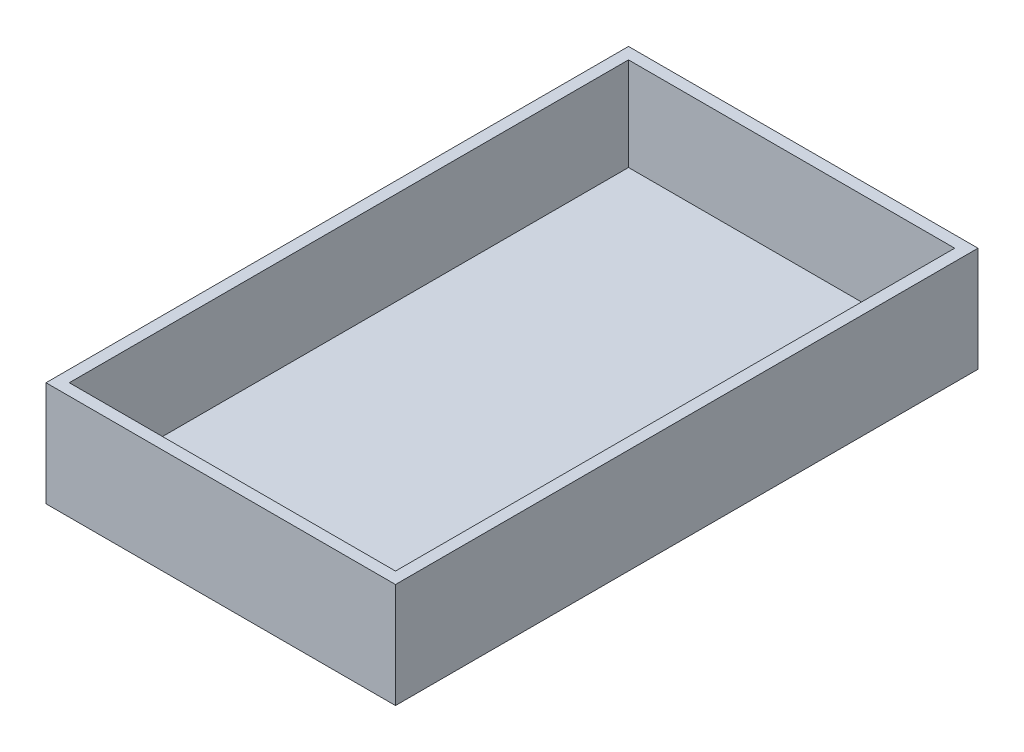
ISO-10303-21;
HEADER;
FILE_DESCRIPTION(('STEP AP214'),'2;1');
FILE_NAME('part.step','',(''),(''),'','','');
FILE_SCHEMA(('AUTOMOTIVE_DESIGN { 1 0 10303 214 1 1 1 1 }'));
ENDSEC;
DATA;
#1=APPLICATION_CONTEXT('core data for automotive mechanical design processes');
#2=APPLICATION_PROTOCOL_DEFINITION('international standard','automotive_design',2000,#1);
#3=PRODUCT_CONTEXT('',#1,'mechanical');
#4=PRODUCT('Part','Part','',(#3));
#5=PRODUCT_RELATED_PRODUCT_CATEGORY('part','',(#4));
#6=PRODUCT_DEFINITION_FORMATION('','',#4);
#7=PRODUCT_DEFINITION_CONTEXT('part definition',#1,'design');
#8=PRODUCT_DEFINITION('design','',#6,#7);
#9=PRODUCT_DEFINITION_SHAPE('','',#8);
#10=(LENGTH_UNIT() NAMED_UNIT(*) SI_UNIT(.MILLI.,.METRE.));
#11=(NAMED_UNIT(*) PLANE_ANGLE_UNIT() SI_UNIT($,.RADIAN.));
#12=(NAMED_UNIT(*) SI_UNIT($,.STERADIAN.) SOLID_ANGLE_UNIT());
#13=UNCERTAINTY_MEASURE_WITH_UNIT(LENGTH_MEASURE(1.E-05),#10,'distance_accuracy_value','');
#14=(GEOMETRIC_REPRESENTATION_CONTEXT(3) GLOBAL_UNCERTAINTY_ASSIGNED_CONTEXT((#13)) GLOBAL_UNIT_ASSIGNED_CONTEXT((#10,
#11,#12)) REPRESENTATION_CONTEXT('',''));
#15=CARTESIAN_POINT('',(0.,0.,0.));
#16=DIRECTION('',(0.,0.,1.));
#17=DIRECTION('',(1.,0.,0.));
#18=AXIS2_PLACEMENT_3D('',#15,#16,#17);
#19=CARTESIAN_POINT('',(-150.,-50.,500.));
#20=DIRECTION('',(1.,0.,0.));
#21=DIRECTION('',(0.,0.,-1.));
#22=AXIS2_PLACEMENT_3D('',#19,#20,#21);
#23=PLANE('',#22);
#24=DIRECTION('',(0.,0.,1.));
#25=VECTOR('',#24,1.);
#26=CARTESIAN_POINT('',(-150.,40.,500.));
#27=LINE('',#26,#25);
#28=CARTESIAN_POINT('',(-150.,40.,0.));
#29=VERTEX_POINT('',#28);
#30=CARTESIAN_POINT('',(-150.,40.,500.));
#31=VERTEX_POINT('',#30);
#32=EDGE_CURVE('E127',#29,#31,#27,.T.);
#33=ORIENTED_EDGE('',*,*,#32,.F.);
#34=DIRECTION('',(0.,-1.,0.));
#35=VECTOR('',#34,1.);
#36=CARTESIAN_POINT('',(-150.,-50.,0.));
#37=LINE('',#36,#35);
#38=CARTESIAN_POINT('',(-150.,-50.,0.));
#39=VERTEX_POINT('',#38);
#40=EDGE_CURVE('E107',#29,#39,#37,.T.);
#41=ORIENTED_EDGE('',*,*,#40,.T.);
#42=DIRECTION('',(0.,0.,-1.));
#43=VECTOR('',#42,1.);
#44=CARTESIAN_POINT('',(-150.,-50.,500.));
#45=LINE('',#44,#43);
#46=CARTESIAN_POINT('',(-150.,-50.,500.));
#47=VERTEX_POINT('',#46);
#48=EDGE_CURVE('E142',#47,#39,#45,.T.);
#49=ORIENTED_EDGE('',*,*,#48,.F.);
#50=DIRECTION('',(0.,-1.,0.));
#51=VECTOR('',#50,1.);
#52=CARTESIAN_POINT('',(-150.,-50.,500.));
#53=LINE('',#52,#51);
#54=EDGE_CURVE('E136',#31,#47,#53,.T.);
#55=ORIENTED_EDGE('',*,*,#54,.F.);
#56=EDGE_LOOP('',(#33,#41,#49,#55));
#57=FACE_BOUND('',#56,.T.);
#58=ADVANCED_FACE('F45',(#57),#23,.F.);
#59=CARTESIAN_POINT('',(150.,-50.,500.));
#60=DIRECTION('',(-1.,0.,0.));
#61=DIRECTION('',(0.,0.,1.));
#62=AXIS2_PLACEMENT_3D('',#59,#60,#61);
#63=PLANE('',#62);
#64=DIRECTION('',(0.,0.,-1.));
#65=VECTOR('',#64,1.);
#66=CARTESIAN_POINT('',(150.,40.,500.));
#67=LINE('',#66,#65);
#68=CARTESIAN_POINT('',(150.,40.,500.));
#69=VERTEX_POINT('',#68);
#70=CARTESIAN_POINT('',(150.,40.,0.));
#71=VERTEX_POINT('',#70);
#72=EDGE_CURVE('E63',#69,#71,#67,.T.);
#73=ORIENTED_EDGE('',*,*,#72,.F.);
#74=DIRECTION('',(0.,1.,0.));
#75=VECTOR('',#74,1.);
#76=CARTESIAN_POINT('',(150.,-50.,500.));
#77=LINE('',#76,#75);
#78=CARTESIAN_POINT('',(150.,-50.,500.));
#79=VERTEX_POINT('',#78);
#80=EDGE_CURVE('E138',#79,#69,#77,.T.);
#81=ORIENTED_EDGE('',*,*,#80,.F.);
#82=DIRECTION('',(0.,0.,-1.));
#83=VECTOR('',#82,1.);
#84=CARTESIAN_POINT('',(150.,-50.,500.));
#85=LINE('',#84,#83);
#86=CARTESIAN_POINT('',(150.,-50.,0.));
#87=VERTEX_POINT('',#86);
#88=EDGE_CURVE('E157',#79,#87,#85,.T.);
#89=ORIENTED_EDGE('',*,*,#88,.T.);
#90=DIRECTION('',(0.,1.,0.));
#91=VECTOR('',#90,1.);
#92=CARTESIAN_POINT('',(150.,-50.,0.));
#93=LINE('',#92,#91);
#94=EDGE_CURVE('E144',#87,#71,#93,.T.);
#95=ORIENTED_EDGE('',*,*,#94,.T.);
#96=EDGE_LOOP('',(#73,#81,#89,#95));
#97=FACE_BOUND('',#96,.T.);
#98=ADVANCED_FACE('F223',(#97),#63,.F.);
#99=CARTESIAN_POINT('',(0.,0.,500.));
#100=DIRECTION('',(0.,0.,1.));
#101=DIRECTION('',(1.,0.,0.));
#102=AXIS2_PLACEMENT_3D('',#99,#100,#101);
#103=PLANE('',#102);
#104=ORIENTED_EDGE('',*,*,#80,.T.);
#105=DIRECTION('',(1.,0.,0.));
#106=VECTOR('',#105,1.);
#107=CARTESIAN_POINT('',(150.,40.,500.));
#108=LINE('',#107,#106);
#109=EDGE_CURVE('E130',#31,#69,#108,.T.);
#110=ORIENTED_EDGE('',*,*,#109,.F.);
#111=ORIENTED_EDGE('',*,*,#54,.T.);
#112=DIRECTION('',(1.,0.,0.));
#113=VECTOR('',#112,1.);
#114=CARTESIAN_POINT('',(150.,-50.,500.));
#115=LINE('',#114,#113);
#116=EDGE_CURVE('E96',#47,#79,#115,.T.);
#117=ORIENTED_EDGE('',*,*,#116,.T.);
#118=EDGE_LOOP('',(#104,#110,#111,#117));
#119=FACE_BOUND('',#118,.T.);
#120=ADVANCED_FACE('F135',(#119),#103,.T.);
#121=CARTESIAN_POINT('',(0.,0.,0.));
#122=DIRECTION('',(0.,0.,1.));
#123=DIRECTION('',(1.,0.,0.));
#124=AXIS2_PLACEMENT_3D('',#121,#122,#123);
#125=PLANE('',#124);
#126=DIRECTION('',(-1.,0.,0.));
#127=VECTOR('',#126,1.);
#128=CARTESIAN_POINT('',(150.,40.,0.));
#129=LINE('',#128,#127);
#130=EDGE_CURVE('E131',#71,#29,#129,.T.);
#131=ORIENTED_EDGE('',*,*,#130,.F.);
#132=ORIENTED_EDGE('',*,*,#94,.F.);
#133=DIRECTION('',(1.,0.,0.));
#134=VECTOR('',#133,1.);
#135=CARTESIAN_POINT('',(150.,-50.,0.));
#136=LINE('',#135,#134);
#137=EDGE_CURVE('E150',#39,#87,#136,.T.);
#138=ORIENTED_EDGE('',*,*,#137,.F.);
#139=ORIENTED_EDGE('',*,*,#40,.F.);
#140=EDGE_LOOP('',(#131,#132,#138,#139));
#141=FACE_BOUND('',#140,.T.);
#142=ADVANCED_FACE('F218',(#141),#125,.F.);
#143=CARTESIAN_POINT('',(150.,-50.,500.));
#144=DIRECTION('',(0.,1.,0.));
#145=DIRECTION('',(-1.,0.,0.));
#146=AXIS2_PLACEMENT_3D('',#143,#144,#145);
#147=PLANE('',#146);
#148=ORIENTED_EDGE('',*,*,#137,.T.);
#149=ORIENTED_EDGE('',*,*,#88,.F.);
#150=ORIENTED_EDGE('',*,*,#116,.F.);
#151=ORIENTED_EDGE('',*,*,#48,.T.);
#152=EDGE_LOOP('',(#148,#149,#150,#151));
#153=FACE_BOUND('',#152,.T.);
#154=ADVANCED_FACE('F211',(#153),#147,.F.);
#155=CARTESIAN_POINT('',(0.,40.,0.));
#156=DIRECTION('',(0.,1.,0.));
#157=DIRECTION('',(-1.,0.,0.));
#158=AXIS2_PLACEMENT_3D('',#155,#156,#157);
#159=PLANE('',#158);
#160=DIRECTION('',(0.,0.,-1.));
#161=VECTOR('',#160,1.);
#162=CARTESIAN_POINT('',(140.,40.,500.));
#163=LINE('',#162,#161);
#164=CARTESIAN_POINT('',(140.,40.,490.));
#165=VERTEX_POINT('',#164);
#166=CARTESIAN_POINT('',(140.,40.,10.));
#167=VERTEX_POINT('',#166);
#168=EDGE_CURVE('E177',#165,#167,#163,.T.);
#169=ORIENTED_EDGE('',*,*,#168,.F.);
#170=DIRECTION('',(-1.,0.,0.));
#171=VECTOR('',#170,1.);
#172=CARTESIAN_POINT('',(150.,40.,490.));
#173=LINE('',#172,#171);
#174=CARTESIAN_POINT('',(-140.,40.,490.));
#175=VERTEX_POINT('',#174);
#176=EDGE_CURVE('E11',#165,#175,#173,.T.);
#177=ORIENTED_EDGE('',*,*,#176,.T.);
#178=DIRECTION('',(0.,0.,-1.));
#179=VECTOR('',#178,1.);
#180=CARTESIAN_POINT('',(-140.,40.,500.));
#181=LINE('',#180,#179);
#182=CARTESIAN_POINT('',(-140.,40.,10.));
#183=VERTEX_POINT('',#182);
#184=EDGE_CURVE('E193',#175,#183,#181,.T.);
#185=ORIENTED_EDGE('',*,*,#184,.T.);
#186=DIRECTION('',(-1.,0.,0.));
#187=VECTOR('',#186,1.);
#188=CARTESIAN_POINT('',(150.,40.,10.));
#189=LINE('',#188,#187);
#190=EDGE_CURVE('E116',#167,#183,#189,.T.);
#191=ORIENTED_EDGE('',*,*,#190,.F.);
#192=EDGE_LOOP('',(#169,#177,#185,#191));
#193=FACE_BOUND('',#192,.T.);
#194=ORIENTED_EDGE('',*,*,#32,.T.);
#195=ORIENTED_EDGE('',*,*,#109,.T.);
#196=ORIENTED_EDGE('',*,*,#72,.T.);
#197=ORIENTED_EDGE('',*,*,#130,.T.);
#198=EDGE_LOOP('',(#194,#195,#196,#197));
#199=FACE_BOUND('',#198,.T.);
#200=ADVANCED_FACE('F129',(#193,#199),#159,.T.);
#201=CARTESIAN_POINT('',(-140.,-50.,500.));
#202=DIRECTION('',(1.,0.,0.));
#203=DIRECTION('',(0.,0.,-1.));
#204=AXIS2_PLACEMENT_3D('',#201,#202,#203);
#205=PLANE('',#204);
#206=DIRECTION('',(0.,-1.,0.));
#207=VECTOR('',#206,1.);
#208=CARTESIAN_POINT('',(-140.,-50.,10.));
#209=LINE('',#208,#207);
#210=CARTESIAN_POINT('',(-140.,-40.,10.));
#211=VERTEX_POINT('',#210);
#212=EDGE_CURVE('E49',#183,#211,#209,.T.);
#213=ORIENTED_EDGE('',*,*,#212,.F.);
#214=ORIENTED_EDGE('',*,*,#184,.F.);
#215=DIRECTION('',(0.,-1.,0.));
#216=VECTOR('',#215,1.);
#217=CARTESIAN_POINT('',(-140.,-50.,490.));
#218=LINE('',#217,#216);
#219=CARTESIAN_POINT('',(-140.,-40.,490.));
#220=VERTEX_POINT('',#219);
#221=EDGE_CURVE('E173',#175,#220,#218,.T.);
#222=ORIENTED_EDGE('',*,*,#221,.T.);
#223=DIRECTION('',(0.,0.,-1.));
#224=VECTOR('',#223,1.);
#225=CARTESIAN_POINT('',(-140.,-40.,500.));
#226=LINE('',#225,#224);
#227=EDGE_CURVE('E189',#220,#211,#226,.T.);
#228=ORIENTED_EDGE('',*,*,#227,.T.);
#229=EDGE_LOOP('',(#213,#214,#222,#228));
#230=FACE_BOUND('',#229,.T.);
#231=ADVANCED_FACE('F199',(#230),#205,.T.);
#232=CARTESIAN_POINT('',(150.,-39.9999999999999,500.));
#233=DIRECTION('',(0.,1.,0.));
#234=DIRECTION('',(-1.,0.,0.));
#235=AXIS2_PLACEMENT_3D('',#232,#233,#234);
#236=PLANE('',#235);
#237=DIRECTION('',(1.,0.,0.));
#238=VECTOR('',#237,1.);
#239=CARTESIAN_POINT('',(150.,-39.9999999999999,10.));
#240=LINE('',#239,#238);
#241=CARTESIAN_POINT('',(140.,-39.9999999999999,10.));
#242=VERTEX_POINT('',#241);
#243=EDGE_CURVE('E72',#211,#242,#240,.T.);
#244=ORIENTED_EDGE('',*,*,#243,.F.);
#245=ORIENTED_EDGE('',*,*,#227,.F.);
#246=DIRECTION('',(1.,0.,0.));
#247=VECTOR('',#246,1.);
#248=CARTESIAN_POINT('',(150.,-39.9999999999999,490.));
#249=LINE('',#248,#247);
#250=CARTESIAN_POINT('',(140.,-39.9999999999999,490.));
#251=VERTEX_POINT('',#250);
#252=EDGE_CURVE('E170',#220,#251,#249,.T.);
#253=ORIENTED_EDGE('',*,*,#252,.T.);
#254=DIRECTION('',(0.,0.,-1.));
#255=VECTOR('',#254,1.);
#256=CARTESIAN_POINT('',(140.,-39.9999999999999,500.));
#257=LINE('',#256,#255);
#258=EDGE_CURVE('E183',#251,#242,#257,.T.);
#259=ORIENTED_EDGE('',*,*,#258,.T.);
#260=EDGE_LOOP('',(#244,#245,#253,#259));
#261=FACE_BOUND('',#260,.T.);
#262=ADVANCED_FACE('F201',(#261),#236,.T.);
#263=CARTESIAN_POINT('',(140.,-50.,500.));
#264=DIRECTION('',(-1.,0.,0.));
#265=DIRECTION('',(0.,0.,1.));
#266=AXIS2_PLACEMENT_3D('',#263,#264,#265);
#267=PLANE('',#266);
#268=DIRECTION('',(0.,1.,0.));
#269=VECTOR('',#268,1.);
#270=CARTESIAN_POINT('',(140.,-50.,10.));
#271=LINE('',#270,#269);
#272=EDGE_CURVE('E186',#242,#167,#271,.T.);
#273=ORIENTED_EDGE('',*,*,#272,.F.);
#274=ORIENTED_EDGE('',*,*,#258,.F.);
#275=DIRECTION('',(0.,1.,0.));
#276=VECTOR('',#275,1.);
#277=CARTESIAN_POINT('',(140.,-50.,490.));
#278=LINE('',#277,#276);
#279=EDGE_CURVE('E55',#251,#165,#278,.T.);
#280=ORIENTED_EDGE('',*,*,#279,.T.);
#281=ORIENTED_EDGE('',*,*,#168,.T.);
#282=EDGE_LOOP('',(#273,#274,#280,#281));
#283=FACE_BOUND('',#282,.T.);
#284=ADVANCED_FACE('F207',(#283),#267,.T.);
#285=CARTESIAN_POINT('',(0.,0.,490.));
#286=DIRECTION('',(0.,0.,1.));
#287=DIRECTION('',(1.,0.,0.));
#288=AXIS2_PLACEMENT_3D('',#285,#286,#287);
#289=PLANE('',#288);
#290=ORIENTED_EDGE('',*,*,#221,.F.);
#291=ORIENTED_EDGE('',*,*,#176,.F.);
#292=ORIENTED_EDGE('',*,*,#279,.F.);
#293=ORIENTED_EDGE('',*,*,#252,.F.);
#294=EDGE_LOOP('',(#290,#291,#292,#293));
#295=FACE_BOUND('',#294,.T.);
#296=ADVANCED_FACE('F209',(#295),#289,.F.);
#297=CARTESIAN_POINT('',(0.,0.,10.));
#298=DIRECTION('',(0.,0.,1.));
#299=DIRECTION('',(1.,0.,0.));
#300=AXIS2_PLACEMENT_3D('',#297,#298,#299);
#301=PLANE('',#300);
#302=ORIENTED_EDGE('',*,*,#212,.T.);
#303=ORIENTED_EDGE('',*,*,#243,.T.);
#304=ORIENTED_EDGE('',*,*,#272,.T.);
#305=ORIENTED_EDGE('',*,*,#190,.T.);
#306=EDGE_LOOP('',(#302,#303,#304,#305));
#307=FACE_BOUND('',#306,.T.);
#308=ADVANCED_FACE('F47',(#307),#301,.T.);
#309=CLOSED_SHELL('',(#58,#98,#120,#142,#154,#200,#231,#262,#284,#296,#308));
#310=MANIFOLD_SOLID_BREP('B2',#309);
#311=ADVANCED_BREP_SHAPE_REPRESENTATION('',(#18,#310),#14);
#312=SHAPE_DEFINITION_REPRESENTATION(#9,#311);
ENDSEC;
END-ISO-10303-21;
